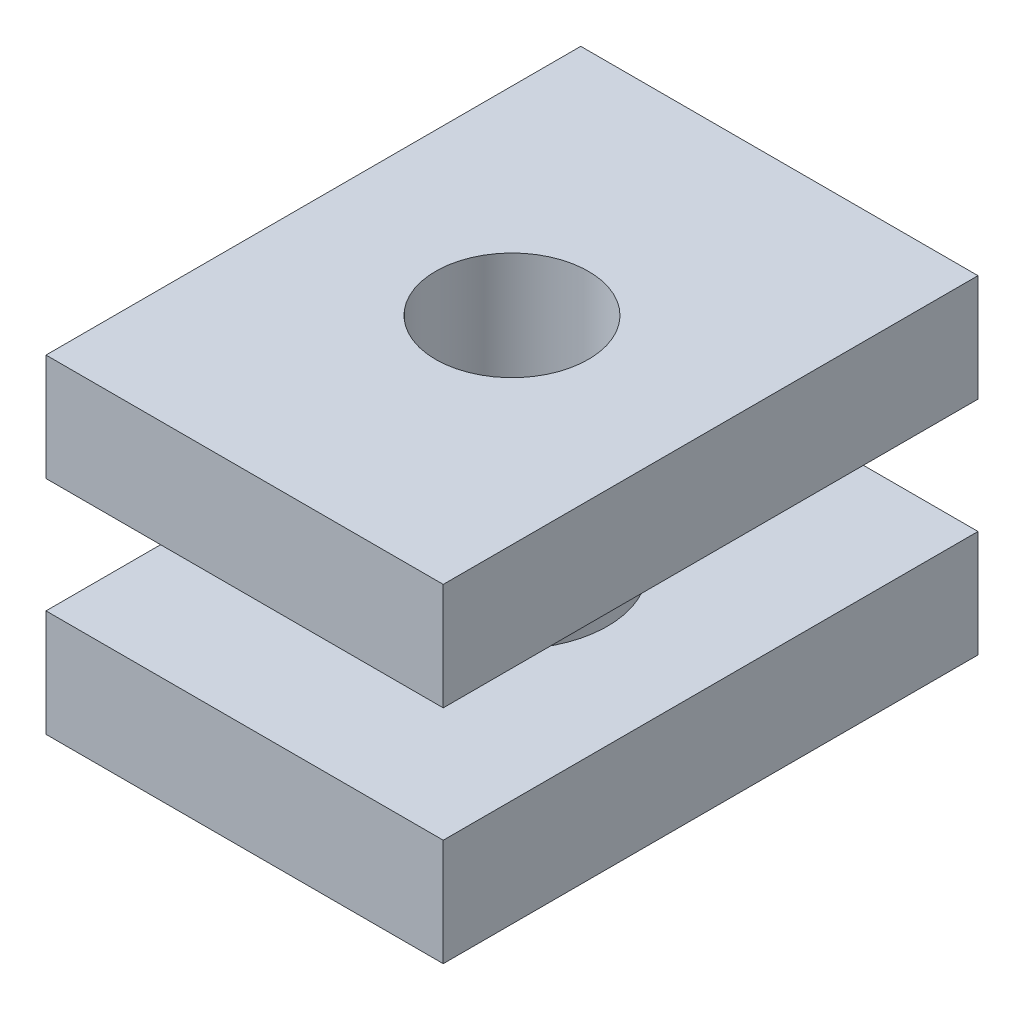
ISO-10303-21;
HEADER;
FILE_DESCRIPTION(('STEP AP214'),'2;1');
FILE_NAME('part.step','',(''),(''),'','','');
FILE_SCHEMA(('AUTOMOTIVE_DESIGN { 1 0 10303 214 1 1 1 1 }'));
ENDSEC;
DATA;
#1=APPLICATION_CONTEXT('core data for automotive mechanical design processes');
#2=APPLICATION_PROTOCOL_DEFINITION('international standard','automotive_design',2000,#1);
#3=PRODUCT_CONTEXT('',#1,'mechanical');
#4=PRODUCT('Part','Part','',(#3));
#5=PRODUCT_RELATED_PRODUCT_CATEGORY('part','',(#4));
#6=PRODUCT_DEFINITION_FORMATION('','',#4);
#7=PRODUCT_DEFINITION_CONTEXT('part definition',#1,'design');
#8=PRODUCT_DEFINITION('design','',#6,#7);
#9=PRODUCT_DEFINITION_SHAPE('','',#8);
#10=(LENGTH_UNIT() NAMED_UNIT(*) SI_UNIT(.MILLI.,.METRE.));
#11=(NAMED_UNIT(*) PLANE_ANGLE_UNIT() SI_UNIT($,.RADIAN.));
#12=(NAMED_UNIT(*) SI_UNIT($,.STERADIAN.) SOLID_ANGLE_UNIT());
#13=UNCERTAINTY_MEASURE_WITH_UNIT(LENGTH_MEASURE(1.E-05),#10,'distance_accuracy_value','');
#14=(GEOMETRIC_REPRESENTATION_CONTEXT(3) GLOBAL_UNCERTAINTY_ASSIGNED_CONTEXT((#13)) GLOBAL_UNIT_ASSIGNED_CONTEXT((#10,
#11,#12)) REPRESENTATION_CONTEXT('',''));
#15=CARTESIAN_POINT('',(0.,0.,0.));
#16=DIRECTION('',(0.,0.,1.));
#17=DIRECTION('',(1.,0.,0.));
#18=AXIS2_PLACEMENT_3D('',#15,#16,#17);
#19=CARTESIAN_POINT('',(0.,2.7305,0.));
#20=DIRECTION('',(0.,-1.,0.));
#21=DIRECTION('',(0.,0.,-1.));
#22=AXIS2_PLACEMENT_3D('',#19,#20,#21);
#23=CYLINDRICAL_SURFACE('',#22,1.5875);
#24=CARTESIAN_POINT('',(0.,-0.9525,0.));
#25=DIRECTION('',(0.,1.,0.));
#26=DIRECTION('',(0.,0.,1.));
#27=AXIS2_PLACEMENT_3D('',#24,#25,#26);
#28=CIRCLE('',#27,1.5875);
#29=CARTESIAN_POINT('',(0.,-0.9525,1.5875));
#30=VERTEX_POINT('',#29);
#31=EDGE_CURVE('E41',#30,#30,#28,.T.);
#32=ORIENTED_EDGE('',*,*,#31,.T.);
#33=EDGE_LOOP('',(#32));
#34=FACE_BOUND('',#33,.T.);
#35=CARTESIAN_POINT('',(0.,0.9525,0.));
#36=DIRECTION('',(0.,1.,0.));
#37=DIRECTION('',(0.,0.,1.));
#38=AXIS2_PLACEMENT_3D('',#35,#36,#37);
#39=CIRCLE('',#38,1.5875);
#40=CARTESIAN_POINT('',(0.,0.9525,1.5875));
#41=VERTEX_POINT('',#40);
#42=EDGE_CURVE('E11',#41,#41,#39,.T.);
#43=ORIENTED_EDGE('',*,*,#42,.F.);
#44=EDGE_LOOP('',(#43));
#45=FACE_BOUND('',#44,.T.);
#46=ADVANCED_FACE('F33',(#34,#45),#23,.T.);
#47=CARTESIAN_POINT('',(-3.302,-0.9525,4.445));
#48=DIRECTION('',(0.,0.,1.));
#49=DIRECTION('',(1.,0.,0.));
#50=AXIS2_PLACEMENT_3D('',#47,#48,#49);
#51=PLANE('',#50);
#52=DIRECTION('',(-1.,0.,0.));
#53=VECTOR('',#52,1.);
#54=CARTESIAN_POINT('',(-3.302,-2.7305,4.445));
#55=LINE('',#54,#53);
#56=CARTESIAN_POINT('',(3.302,-2.7305,4.445));
#57=VERTEX_POINT('',#56);
#58=CARTESIAN_POINT('',(-3.302,-2.7305,4.445));
#59=VERTEX_POINT('',#58);
#60=EDGE_CURVE('E150',#57,#59,#55,.T.);
#61=ORIENTED_EDGE('',*,*,#60,.F.);
#62=DIRECTION('',(0.,-1.,0.));
#63=VECTOR('',#62,1.);
#64=CARTESIAN_POINT('',(3.302,-0.9525,4.445));
#65=LINE('',#64,#63);
#66=CARTESIAN_POINT('',(3.302,-0.9525,4.445));
#67=VERTEX_POINT('',#66);
#68=EDGE_CURVE('E49',#67,#57,#65,.T.);
#69=ORIENTED_EDGE('',*,*,#68,.F.);
#70=DIRECTION('',(-1.,0.,0.));
#71=VECTOR('',#70,1.);
#72=CARTESIAN_POINT('',(-3.302,-0.9525,4.445));
#73=LINE('',#72,#71);
#74=CARTESIAN_POINT('',(-3.302,-0.9525,4.445));
#75=VERTEX_POINT('',#74);
#76=EDGE_CURVE('E154',#67,#75,#73,.T.);
#77=ORIENTED_EDGE('',*,*,#76,.T.);
#78=DIRECTION('',(0.,-1.,0.));
#79=VECTOR('',#78,1.);
#80=CARTESIAN_POINT('',(-3.302,-0.9525,4.445));
#81=LINE('',#80,#79);
#82=EDGE_CURVE('E78',#75,#59,#81,.T.);
#83=ORIENTED_EDGE('',*,*,#82,.T.);
#84=EDGE_LOOP('',(#61,#69,#77,#83));
#85=FACE_BOUND('',#84,.T.);
#86=ADVANCED_FACE('F192',(#85),#51,.T.);
#87=CARTESIAN_POINT('',(3.302,-0.9525,4.445));
#88=DIRECTION('',(1.,0.,0.));
#89=DIRECTION('',(0.,0.,-1.));
#90=AXIS2_PLACEMENT_3D('',#87,#88,#89);
#91=PLANE('',#90);
#92=DIRECTION('',(0.,0.,1.));
#93=VECTOR('',#92,1.);
#94=CARTESIAN_POINT('',(3.302,-2.7305,4.445));
#95=LINE('',#94,#93);
#96=CARTESIAN_POINT('',(3.302,-2.7305,-4.445));
#97=VERTEX_POINT('',#96);
#98=EDGE_CURVE('E157',#97,#57,#95,.T.);
#99=ORIENTED_EDGE('',*,*,#98,.F.);
#100=DIRECTION('',(0.,-1.,0.));
#101=VECTOR('',#100,1.);
#102=CARTESIAN_POINT('',(3.302,-0.9525,-4.445));
#103=LINE('',#102,#101);
#104=CARTESIAN_POINT('',(3.302,-0.9525,-4.445));
#105=VERTEX_POINT('',#104);
#106=EDGE_CURVE('E67',#105,#97,#103,.T.);
#107=ORIENTED_EDGE('',*,*,#106,.F.);
#108=DIRECTION('',(0.,0.,1.));
#109=VECTOR('',#108,1.);
#110=CARTESIAN_POINT('',(3.302,-0.9525,4.445));
#111=LINE('',#110,#109);
#112=EDGE_CURVE('E161',#105,#67,#111,.T.);
#113=ORIENTED_EDGE('',*,*,#112,.T.);
#114=ORIENTED_EDGE('',*,*,#68,.T.);
#115=EDGE_LOOP('',(#99,#107,#113,#114));
#116=FACE_BOUND('',#115,.T.);
#117=ADVANCED_FACE('F189',(#116),#91,.T.);
#118=CARTESIAN_POINT('',(-3.302,-0.9525,-4.445));
#119=DIRECTION('',(0.,0.,-1.));
#120=DIRECTION('',(-1.,0.,0.));
#121=AXIS2_PLACEMENT_3D('',#118,#119,#120);
#122=PLANE('',#121);
#123=DIRECTION('',(1.,0.,0.));
#124=VECTOR('',#123,1.);
#125=CARTESIAN_POINT('',(-3.302,-2.7305,-4.445));
#126=LINE('',#125,#124);
#127=CARTESIAN_POINT('',(-3.302,-2.7305,-4.445));
#128=VERTEX_POINT('',#127);
#129=EDGE_CURVE('E168',#128,#97,#126,.T.);
#130=ORIENTED_EDGE('',*,*,#129,.F.);
#131=DIRECTION('',(0.,-1.,0.));
#132=VECTOR('',#131,1.);
#133=CARTESIAN_POINT('',(-3.302,-0.9525,-4.445));
#134=LINE('',#133,#132);
#135=CARTESIAN_POINT('',(-3.302,-0.9525,-4.445));
#136=VERTEX_POINT('',#135);
#137=EDGE_CURVE('E174',#136,#128,#134,.T.);
#138=ORIENTED_EDGE('',*,*,#137,.F.);
#139=DIRECTION('',(1.,0.,0.));
#140=VECTOR('',#139,1.);
#141=CARTESIAN_POINT('',(-3.302,-0.9525,-4.445));
#142=LINE('',#141,#140);
#143=EDGE_CURVE('E159',#136,#105,#142,.T.);
#144=ORIENTED_EDGE('',*,*,#143,.T.);
#145=ORIENTED_EDGE('',*,*,#106,.T.);
#146=EDGE_LOOP('',(#130,#138,#144,#145));
#147=FACE_BOUND('',#146,.T.);
#148=ADVANCED_FACE('F190',(#147),#122,.T.);
#149=CARTESIAN_POINT('',(-3.302,-0.9525,4.445));
#150=DIRECTION('',(-1.,0.,0.));
#151=DIRECTION('',(0.,0.,1.));
#152=AXIS2_PLACEMENT_3D('',#149,#150,#151);
#153=PLANE('',#152);
#154=DIRECTION('',(0.,0.,-1.));
#155=VECTOR('',#154,1.);
#156=CARTESIAN_POINT('',(-3.302,-2.7305,4.445));
#157=LINE('',#156,#155);
#158=EDGE_CURVE('E165',#59,#128,#157,.T.);
#159=ORIENTED_EDGE('',*,*,#158,.F.);
#160=ORIENTED_EDGE('',*,*,#82,.F.);
#161=DIRECTION('',(0.,0.,-1.));
#162=VECTOR('',#161,1.);
#163=CARTESIAN_POINT('',(-3.302,-0.9525,4.445));
#164=LINE('',#163,#162);
#165=EDGE_CURVE('E156',#75,#136,#164,.T.);
#166=ORIENTED_EDGE('',*,*,#165,.T.);
#167=ORIENTED_EDGE('',*,*,#137,.T.);
#168=EDGE_LOOP('',(#159,#160,#166,#167));
#169=FACE_BOUND('',#168,.T.);
#170=ADVANCED_FACE('F185',(#169),#153,.T.);
#171=CARTESIAN_POINT('',(0.,-0.9525,0.));
#172=DIRECTION('',(0.,1.,0.));
#173=DIRECTION('',(0.,0.,1.));
#174=AXIS2_PLACEMENT_3D('',#171,#172,#173);
#175=PLANE('',#174);
#176=ORIENTED_EDGE('',*,*,#31,.F.);
#177=EDGE_LOOP('',(#176));
#178=FACE_BOUND('',#177,.T.);
#179=ORIENTED_EDGE('',*,*,#76,.F.);
#180=ORIENTED_EDGE('',*,*,#112,.F.);
#181=ORIENTED_EDGE('',*,*,#143,.F.);
#182=ORIENTED_EDGE('',*,*,#165,.F.);
#183=EDGE_LOOP('',(#179,#180,#181,#182));
#184=FACE_BOUND('',#183,.T.);
#185=ADVANCED_FACE('F181',(#178,#184),#175,.T.);
#186=CARTESIAN_POINT('',(0.,-2.7305,0.));
#187=DIRECTION('',(0.,1.,0.));
#188=DIRECTION('',(0.,0.,1.));
#189=AXIS2_PLACEMENT_3D('',#186,#187,#188);
#190=PLANE('',#189);
#191=CARTESIAN_POINT('',(0.,-2.7305,0.));
#192=DIRECTION('',(0.,1.,0.));
#193=DIRECTION('',(0.,0.,1.));
#194=AXIS2_PLACEMENT_3D('',#191,#192,#193);
#195=CIRCLE('',#194,1.27);
#196=CARTESIAN_POINT('',(0.,-2.7305,1.27));
#197=VERTEX_POINT('',#196);
#198=EDGE_CURVE('E145',#197,#197,#195,.T.);
#199=ORIENTED_EDGE('',*,*,#198,.T.);
#200=EDGE_LOOP('',(#199));
#201=FACE_BOUND('',#200,.T.);
#202=ORIENTED_EDGE('',*,*,#60,.T.);
#203=ORIENTED_EDGE('',*,*,#158,.T.);
#204=ORIENTED_EDGE('',*,*,#129,.T.);
#205=ORIENTED_EDGE('',*,*,#98,.T.);
#206=EDGE_LOOP('',(#202,#203,#204,#205));
#207=FACE_BOUND('',#206,.T.);
#208=ADVANCED_FACE('F184',(#201,#207),#190,.F.);
#209=CARTESIAN_POINT('',(-3.302,0.9525,4.445));
#210=DIRECTION('',(0.,0.,1.));
#211=DIRECTION('',(1.,0.,0.));
#212=AXIS2_PLACEMENT_3D('',#209,#210,#211);
#213=PLANE('',#212);
#214=DIRECTION('',(1.,0.,0.));
#215=VECTOR('',#214,1.);
#216=CARTESIAN_POINT('',(-3.302,2.7305,4.445));
#217=LINE('',#216,#215);
#218=CARTESIAN_POINT('',(-3.302,2.7305,4.445));
#219=VERTEX_POINT('',#218);
#220=CARTESIAN_POINT('',(3.302,2.7305,4.445));
#221=VERTEX_POINT('',#220);
#222=EDGE_CURVE('E143',#219,#221,#217,.T.);
#223=ORIENTED_EDGE('',*,*,#222,.F.);
#224=DIRECTION('',(0.,1.,0.));
#225=VECTOR('',#224,1.);
#226=CARTESIAN_POINT('',(-3.302,0.9525,4.445));
#227=LINE('',#226,#225);
#228=CARTESIAN_POINT('',(-3.302,0.9525,4.445));
#229=VERTEX_POINT('',#228);
#230=EDGE_CURVE('E131',#229,#219,#227,.T.);
#231=ORIENTED_EDGE('',*,*,#230,.F.);
#232=DIRECTION('',(1.,0.,0.));
#233=VECTOR('',#232,1.);
#234=CARTESIAN_POINT('',(-3.302,0.9525,4.445));
#235=LINE('',#234,#233);
#236=CARTESIAN_POINT('',(3.302,0.9525,4.445));
#237=VERTEX_POINT('',#236);
#238=EDGE_CURVE('E125',#229,#237,#235,.T.);
#239=ORIENTED_EDGE('',*,*,#238,.T.);
#240=DIRECTION('',(0.,1.,0.));
#241=VECTOR('',#240,1.);
#242=CARTESIAN_POINT('',(3.302,0.9525,4.445));
#243=LINE('',#242,#241);
#244=EDGE_CURVE('E107',#237,#221,#243,.T.);
#245=ORIENTED_EDGE('',*,*,#244,.T.);
#246=EDGE_LOOP('',(#223,#231,#239,#245));
#247=FACE_BOUND('',#246,.T.);
#248=ADVANCED_FACE('F130',(#247),#213,.T.);
#249=CARTESIAN_POINT('',(-3.302,0.9525,4.445));
#250=DIRECTION('',(-1.,0.,0.));
#251=DIRECTION('',(0.,0.,1.));
#252=AXIS2_PLACEMENT_3D('',#249,#250,#251);
#253=PLANE('',#252);
#254=DIRECTION('',(0.,0.,1.));
#255=VECTOR('',#254,1.);
#256=CARTESIAN_POINT('',(-3.302,2.7305,4.445));
#257=LINE('',#256,#255);
#258=CARTESIAN_POINT('',(-3.302,2.7305,-4.445));
#259=VERTEX_POINT('',#258);
#260=EDGE_CURVE('E132',#259,#219,#257,.T.);
#261=ORIENTED_EDGE('',*,*,#260,.F.);
#262=DIRECTION('',(0.,1.,0.));
#263=VECTOR('',#262,1.);
#264=CARTESIAN_POINT('',(-3.302,0.9525,-4.445));
#265=LINE('',#264,#263);
#266=CARTESIAN_POINT('',(-3.302,0.9525,-4.445));
#267=VERTEX_POINT('',#266);
#268=EDGE_CURVE('E151',#267,#259,#265,.T.);
#269=ORIENTED_EDGE('',*,*,#268,.F.);
#270=DIRECTION('',(0.,0.,1.));
#271=VECTOR('',#270,1.);
#272=CARTESIAN_POINT('',(-3.302,0.9525,4.445));
#273=LINE('',#272,#271);
#274=EDGE_CURVE('E118',#267,#229,#273,.T.);
#275=ORIENTED_EDGE('',*,*,#274,.T.);
#276=ORIENTED_EDGE('',*,*,#230,.T.);
#277=EDGE_LOOP('',(#261,#269,#275,#276));
#278=FACE_BOUND('',#277,.T.);
#279=ADVANCED_FACE('F212',(#278),#253,.T.);
#280=CARTESIAN_POINT('',(-3.302,0.9525,-4.445));
#281=DIRECTION('',(0.,0.,-1.));
#282=DIRECTION('',(-1.,0.,0.));
#283=AXIS2_PLACEMENT_3D('',#280,#281,#282);
#284=PLANE('',#283);
#285=DIRECTION('',(-1.,0.,0.));
#286=VECTOR('',#285,1.);
#287=CARTESIAN_POINT('',(-3.302,2.7305,-4.445));
#288=LINE('',#287,#286);
#289=CARTESIAN_POINT('',(3.302,2.7305,-4.445));
#290=VERTEX_POINT('',#289);
#291=EDGE_CURVE('E135',#290,#259,#288,.T.);
#292=ORIENTED_EDGE('',*,*,#291,.F.);
#293=DIRECTION('',(0.,1.,0.));
#294=VECTOR('',#293,1.);
#295=CARTESIAN_POINT('',(3.302,0.9525,-4.445));
#296=LINE('',#295,#294);
#297=CARTESIAN_POINT('',(3.302,0.9525,-4.445));
#298=VERTEX_POINT('',#297);
#299=EDGE_CURVE('E117',#298,#290,#296,.T.);
#300=ORIENTED_EDGE('',*,*,#299,.F.);
#301=DIRECTION('',(-1.,0.,0.));
#302=VECTOR('',#301,1.);
#303=CARTESIAN_POINT('',(-3.302,0.9525,-4.445));
#304=LINE('',#303,#302);
#305=EDGE_CURVE('E128',#298,#267,#304,.T.);
#306=ORIENTED_EDGE('',*,*,#305,.T.);
#307=ORIENTED_EDGE('',*,*,#268,.T.);
#308=EDGE_LOOP('',(#292,#300,#306,#307));
#309=FACE_BOUND('',#308,.T.);
#310=ADVANCED_FACE('F225',(#309),#284,.T.);
#311=CARTESIAN_POINT('',(3.302,0.9525,4.445));
#312=DIRECTION('',(1.,0.,0.));
#313=DIRECTION('',(0.,0.,-1.));
#314=AXIS2_PLACEMENT_3D('',#311,#312,#313);
#315=PLANE('',#314);
#316=DIRECTION('',(0.,0.,-1.));
#317=VECTOR('',#316,1.);
#318=CARTESIAN_POINT('',(3.302,2.7305,4.445));
#319=LINE('',#318,#317);
#320=EDGE_CURVE('E112',#221,#290,#319,.T.);
#321=ORIENTED_EDGE('',*,*,#320,.F.);
#322=ORIENTED_EDGE('',*,*,#244,.F.);
#323=DIRECTION('',(0.,0.,-1.));
#324=VECTOR('',#323,1.);
#325=CARTESIAN_POINT('',(3.302,0.9525,4.445));
#326=LINE('',#325,#324);
#327=EDGE_CURVE('E110',#237,#298,#326,.T.);
#328=ORIENTED_EDGE('',*,*,#327,.T.);
#329=ORIENTED_EDGE('',*,*,#299,.T.);
#330=EDGE_LOOP('',(#321,#322,#328,#329));
#331=FACE_BOUND('',#330,.T.);
#332=ADVANCED_FACE('F109',(#331),#315,.T.);
#333=CARTESIAN_POINT('',(0.,0.9525,0.));
#334=DIRECTION('',(0.,1.,0.));
#335=DIRECTION('',(0.,0.,1.));
#336=AXIS2_PLACEMENT_3D('',#333,#334,#335);
#337=PLANE('',#336);
#338=ORIENTED_EDGE('',*,*,#42,.T.);
#339=EDGE_LOOP('',(#338));
#340=FACE_BOUND('',#339,.T.);
#341=ORIENTED_EDGE('',*,*,#238,.F.);
#342=ORIENTED_EDGE('',*,*,#274,.F.);
#343=ORIENTED_EDGE('',*,*,#305,.F.);
#344=ORIENTED_EDGE('',*,*,#327,.F.);
#345=EDGE_LOOP('',(#341,#342,#343,#344));
#346=FACE_BOUND('',#345,.T.);
#347=ADVANCED_FACE('F123',(#340,#346),#337,.F.);
#348=CARTESIAN_POINT('',(0.,2.7305,0.));
#349=DIRECTION('',(0.,1.,0.));
#350=DIRECTION('',(0.,0.,1.));
#351=AXIS2_PLACEMENT_3D('',#348,#349,#350);
#352=PLANE('',#351);
#353=CARTESIAN_POINT('',(0.,2.7305,0.));
#354=DIRECTION('',(0.,1.,0.));
#355=DIRECTION('',(0.,0.,1.));
#356=AXIS2_PLACEMENT_3D('',#353,#354,#355);
#357=CIRCLE('',#356,1.27);
#358=CARTESIAN_POINT('',(0.,2.7305,1.27));
#359=VERTEX_POINT('',#358);
#360=EDGE_CURVE('E138',#359,#359,#357,.T.);
#361=ORIENTED_EDGE('',*,*,#360,.F.);
#362=EDGE_LOOP('',(#361));
#363=FACE_BOUND('',#362,.T.);
#364=ORIENTED_EDGE('',*,*,#222,.T.);
#365=ORIENTED_EDGE('',*,*,#320,.T.);
#366=ORIENTED_EDGE('',*,*,#291,.T.);
#367=ORIENTED_EDGE('',*,*,#260,.T.);
#368=EDGE_LOOP('',(#364,#365,#366,#367));
#369=FACE_BOUND('',#368,.T.);
#370=ADVANCED_FACE('F203',(#363,#369),#352,.T.);
#371=CARTESIAN_POINT('',(0.,-2.7305,0.));
#372=DIRECTION('',(0.,1.,0.));
#373=DIRECTION('',(0.,0.,1.));
#374=AXIS2_PLACEMENT_3D('',#371,#372,#373);
#375=CYLINDRICAL_SURFACE('',#374,1.27);
#376=ORIENTED_EDGE('',*,*,#198,.F.);
#377=EDGE_LOOP('',(#376));
#378=FACE_BOUND('',#377,.T.);
#379=ORIENTED_EDGE('',*,*,#360,.T.);
#380=EDGE_LOOP('',(#379));
#381=FACE_BOUND('',#380,.T.);
#382=ADVANCED_FACE('F205',(#378,#381),#375,.F.);
#383=CLOSED_SHELL('',(#46,#86,#117,#148,#170,#185,#208,#248,#279,#310,#332,#347,#370,#382));
#384=MANIFOLD_SOLID_BREP('B2',#383);
#385=ADVANCED_BREP_SHAPE_REPRESENTATION('',(#18,#384),#14);
#386=SHAPE_DEFINITION_REPRESENTATION(#9,#385);
ENDSEC;
END-ISO-10303-21;
